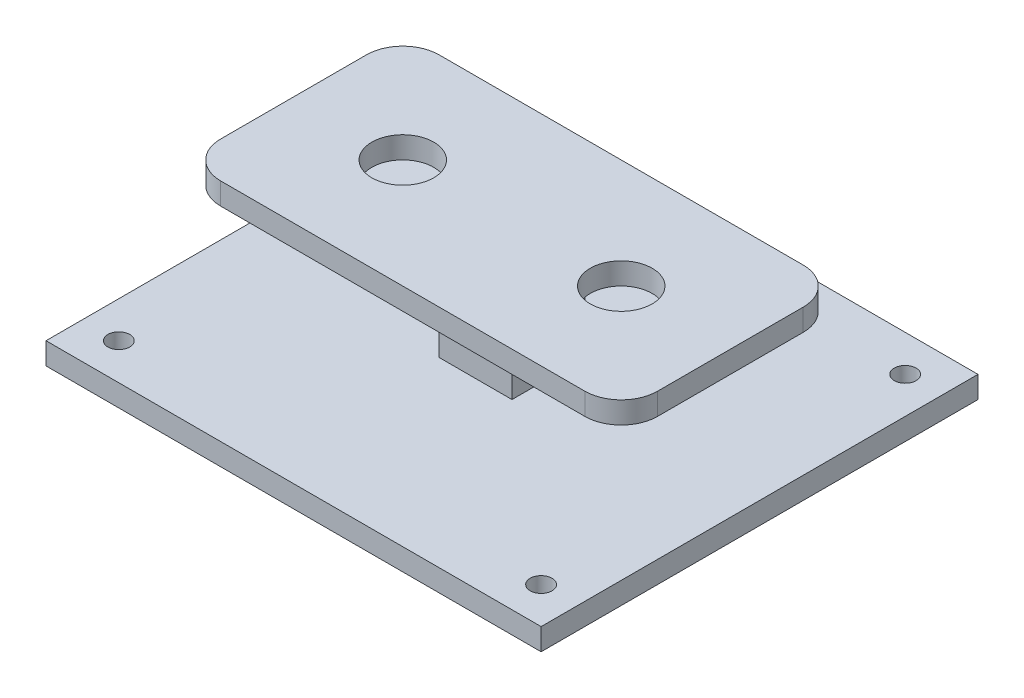
ISO-10303-21;
HEADER;
FILE_DESCRIPTION(('STEP AP214'),'2;1');
FILE_NAME('part.step','',(''),(''),'','','');
FILE_SCHEMA(('AUTOMOTIVE_DESIGN { 1 0 10303 214 1 1 1 1 }'));
ENDSEC;
DATA;
#1=APPLICATION_CONTEXT('core data for automotive mechanical design processes');
#2=APPLICATION_PROTOCOL_DEFINITION('international standard','automotive_design',2000,#1);
#3=PRODUCT_CONTEXT('',#1,'mechanical');
#4=PRODUCT('Part','Part','',(#3));
#5=PRODUCT_RELATED_PRODUCT_CATEGORY('part','',(#4));
#6=PRODUCT_DEFINITION_FORMATION('','',#4);
#7=PRODUCT_DEFINITION_CONTEXT('part definition',#1,'design');
#8=PRODUCT_DEFINITION('design','',#6,#7);
#9=PRODUCT_DEFINITION_SHAPE('','',#8);
#10=(LENGTH_UNIT() NAMED_UNIT(*) SI_UNIT(.MILLI.,.METRE.));
#11=(NAMED_UNIT(*) PLANE_ANGLE_UNIT() SI_UNIT($,.RADIAN.));
#12=(NAMED_UNIT(*) SI_UNIT($,.STERADIAN.) SOLID_ANGLE_UNIT());
#13=UNCERTAINTY_MEASURE_WITH_UNIT(LENGTH_MEASURE(1.E-05),#10,'distance_accuracy_value','');
#14=(GEOMETRIC_REPRESENTATION_CONTEXT(3) GLOBAL_UNCERTAINTY_ASSIGNED_CONTEXT((#13)) GLOBAL_UNIT_ASSIGNED_CONTEXT((#10,
#11,#12)) REPRESENTATION_CONTEXT('',''));
#15=CARTESIAN_POINT('',(0.,0.,0.));
#16=DIRECTION('',(0.,0.,1.));
#17=DIRECTION('',(1.,0.,0.));
#18=AXIS2_PLACEMENT_3D('',#15,#16,#17);
#19=CARTESIAN_POINT('',(0.,3.,0.));
#20=DIRECTION('',(0.,1.,0.));
#21=DIRECTION('',(0.,0.,1.));
#22=AXIS2_PLACEMENT_3D('',#19,#20,#21);
#23=PLANE('',#22);
#24=CARTESIAN_POINT('',(-29.,3.,25.));
#25=DIRECTION('',(0.,1.,0.));
#26=DIRECTION('',(0.,0.,1.));
#27=AXIS2_PLACEMENT_3D('',#24,#25,#26);
#28=CIRCLE('',#27,1.5);
#29=CARTESIAN_POINT('',(-29.,3.,26.5));
#30=VERTEX_POINT('',#29);
#31=EDGE_CURVE('E216',#30,#30,#28,.T.);
#32=ORIENTED_EDGE('',*,*,#31,.F.);
#33=EDGE_LOOP('',(#32));
#34=FACE_BOUND('',#33,.T.);
#35=CARTESIAN_POINT('',(-29.,3.,-25.));
#36=DIRECTION('',(0.,1.,0.));
#37=DIRECTION('',(0.,0.,1.));
#38=AXIS2_PLACEMENT_3D('',#35,#36,#37);
#39=CIRCLE('',#38,1.5);
#40=CARTESIAN_POINT('',(-29.,3.,-23.5));
#41=VERTEX_POINT('',#40);
#42=EDGE_CURVE('E232',#41,#41,#39,.T.);
#43=ORIENTED_EDGE('',*,*,#42,.F.);
#44=EDGE_LOOP('',(#43));
#45=FACE_BOUND('',#44,.T.);
#46=DIRECTION('',(0.,0.,-1.));
#47=VECTOR('',#46,1.);
#48=CARTESIAN_POINT('',(34.,3.,-30.));
#49=LINE('',#48,#47);
#50=CARTESIAN_POINT('',(34.,3.,30.));
#51=VERTEX_POINT('',#50);
#52=CARTESIAN_POINT('',(34.,3.,-30.));
#53=VERTEX_POINT('',#52);
#54=EDGE_CURVE('E240',#51,#53,#49,.T.);
#55=ORIENTED_EDGE('',*,*,#54,.T.);
#56=DIRECTION('',(-1.,0.,0.));
#57=VECTOR('',#56,1.);
#58=CARTESIAN_POINT('',(-34.,3.,-30.));
#59=LINE('',#58,#57);
#60=CARTESIAN_POINT('',(-34.,3.,-30.));
#61=VERTEX_POINT('',#60);
#62=EDGE_CURVE('E244',#53,#61,#59,.T.);
#63=ORIENTED_EDGE('',*,*,#62,.T.);
#64=DIRECTION('',(0.,0.,1.));
#65=VECTOR('',#64,1.);
#66=CARTESIAN_POINT('',(-34.,3.,-30.));
#67=LINE('',#66,#65);
#68=CARTESIAN_POINT('',(-34.,3.,30.));
#69=VERTEX_POINT('',#68);
#70=EDGE_CURVE('E248',#61,#69,#67,.T.);
#71=ORIENTED_EDGE('',*,*,#70,.T.);
#72=DIRECTION('',(1.,0.,0.));
#73=VECTOR('',#72,1.);
#74=CARTESIAN_POINT('',(-34.,3.,30.));
#75=LINE('',#74,#73);
#76=EDGE_CURVE('E251',#69,#51,#75,.T.);
#77=ORIENTED_EDGE('',*,*,#76,.T.);
#78=EDGE_LOOP('',(#55,#63,#71,#77));
#79=FACE_BOUND('',#78,.T.);
#80=CARTESIAN_POINT('',(29.,3.,-25.0000000000001));
#81=DIRECTION('',(0.,1.,0.));
#82=DIRECTION('',(0.,0.,1.));
#83=AXIS2_PLACEMENT_3D('',#80,#81,#82);
#84=CIRCLE('',#83,1.5);
#85=CARTESIAN_POINT('',(29.,3.,-23.5000000000001));
#86=VERTEX_POINT('',#85);
#87=EDGE_CURVE('E224',#86,#86,#84,.T.);
#88=ORIENTED_EDGE('',*,*,#87,.F.);
#89=EDGE_LOOP('',(#88));
#90=FACE_BOUND('',#89,.T.);
#91=CARTESIAN_POINT('',(29.,3.,24.9999999999999));
#92=DIRECTION('',(0.,1.,0.));
#93=DIRECTION('',(0.,0.,1.));
#94=AXIS2_PLACEMENT_3D('',#91,#92,#93);
#95=CIRCLE('',#94,1.5);
#96=CARTESIAN_POINT('',(29.,3.,26.4999999999999));
#97=VERTEX_POINT('',#96);
#98=EDGE_CURVE('E208',#97,#97,#95,.T.);
#99=ORIENTED_EDGE('',*,*,#98,.F.);
#100=EDGE_LOOP('',(#99));
#101=FACE_BOUND('',#100,.T.);
#102=DIRECTION('',(-1.,0.,0.));
#103=VECTOR('',#102,1.);
#104=CARTESIAN_POINT('',(-5.,3.,-5.));
#105=LINE('',#104,#103);
#106=CARTESIAN_POINT('',(5.,3.,-5.));
#107=VERTEX_POINT('',#106);
#108=CARTESIAN_POINT('',(-5.,3.,-5.));
#109=VERTEX_POINT('',#108);
#110=EDGE_CURVE('E189',#107,#109,#105,.T.);
#111=ORIENTED_EDGE('',*,*,#110,.F.);
#112=DIRECTION('',(0.,0.,-1.));
#113=VECTOR('',#112,1.);
#114=CARTESIAN_POINT('',(5.,3.,-5.));
#115=LINE('',#114,#113);
#116=CARTESIAN_POINT('',(5.,3.,5.));
#117=VERTEX_POINT('',#116);
#118=EDGE_CURVE('E186',#117,#107,#115,.T.);
#119=ORIENTED_EDGE('',*,*,#118,.F.);
#120=DIRECTION('',(1.,0.,0.));
#121=VECTOR('',#120,1.);
#122=CARTESIAN_POINT('',(-5.,3.,5.));
#123=LINE('',#122,#121);
#124=CARTESIAN_POINT('',(-5.,3.,5.));
#125=VERTEX_POINT('',#124);
#126=EDGE_CURVE('E166',#125,#117,#123,.T.);
#127=ORIENTED_EDGE('',*,*,#126,.F.);
#128=DIRECTION('',(0.,0.,1.));
#129=VECTOR('',#128,1.);
#130=CARTESIAN_POINT('',(-5.,3.,-5.));
#131=LINE('',#130,#129);
#132=EDGE_CURVE('E193',#109,#125,#131,.T.);
#133=ORIENTED_EDGE('',*,*,#132,.F.);
#134=EDGE_LOOP('',(#111,#119,#127,#133));
#135=FACE_BOUND('',#134,.T.);
#136=ADVANCED_FACE('F39',(#34,#45,#79,#90,#101,#135),#23,.T.);
#137=CARTESIAN_POINT('',(0.,0.,0.));
#138=DIRECTION('',(0.,1.,0.));
#139=DIRECTION('',(0.,0.,1.));
#140=AXIS2_PLACEMENT_3D('',#137,#138,#139);
#141=PLANE('',#140);
#142=DIRECTION('',(0.,0.,-1.));
#143=VECTOR('',#142,1.);
#144=CARTESIAN_POINT('',(34.,0.,-30.));
#145=LINE('',#144,#143);
#146=CARTESIAN_POINT('',(34.,0.,30.));
#147=VERTEX_POINT('',#146);
#148=CARTESIAN_POINT('',(34.,0.,-30.));
#149=VERTEX_POINT('',#148);
#150=EDGE_CURVE('E236',#147,#149,#145,.T.);
#151=ORIENTED_EDGE('',*,*,#150,.F.);
#152=DIRECTION('',(1.,0.,0.));
#153=VECTOR('',#152,1.);
#154=CARTESIAN_POINT('',(-34.,0.,30.));
#155=LINE('',#154,#153);
#156=CARTESIAN_POINT('',(-34.,0.,30.));
#157=VERTEX_POINT('',#156);
#158=EDGE_CURVE('E245',#157,#147,#155,.T.);
#159=ORIENTED_EDGE('',*,*,#158,.F.);
#160=DIRECTION('',(0.,0.,1.));
#161=VECTOR('',#160,1.);
#162=CARTESIAN_POINT('',(-34.,0.,-30.));
#163=LINE('',#162,#161);
#164=CARTESIAN_POINT('',(-34.,0.,-30.));
#165=VERTEX_POINT('',#164);
#166=EDGE_CURVE('E261',#165,#157,#163,.T.);
#167=ORIENTED_EDGE('',*,*,#166,.F.);
#168=DIRECTION('',(-1.,0.,0.));
#169=VECTOR('',#168,1.);
#170=CARTESIAN_POINT('',(-34.,0.,-30.));
#171=LINE('',#170,#169);
#172=EDGE_CURVE('E258',#149,#165,#171,.T.);
#173=ORIENTED_EDGE('',*,*,#172,.F.);
#174=EDGE_LOOP('',(#151,#159,#167,#173));
#175=FACE_BOUND('',#174,.T.);
#176=CARTESIAN_POINT('',(-29.,0.,-25.));
#177=DIRECTION('',(0.,1.,0.));
#178=DIRECTION('',(0.,0.,1.));
#179=AXIS2_PLACEMENT_3D('',#176,#177,#178);
#180=CIRCLE('',#179,1.5);
#181=CARTESIAN_POINT('',(-29.,0.,-23.5));
#182=VERTEX_POINT('',#181);
#183=EDGE_CURVE('E228',#182,#182,#180,.T.);
#184=ORIENTED_EDGE('',*,*,#183,.T.);
#185=EDGE_LOOP('',(#184));
#186=FACE_BOUND('',#185,.T.);
#187=CARTESIAN_POINT('',(29.,0.,-25.0000000000001));
#188=DIRECTION('',(0.,1.,0.));
#189=DIRECTION('',(0.,0.,1.));
#190=AXIS2_PLACEMENT_3D('',#187,#188,#189);
#191=CIRCLE('',#190,1.5);
#192=CARTESIAN_POINT('',(29.,0.,-23.5000000000001));
#193=VERTEX_POINT('',#192);
#194=EDGE_CURVE('E220',#193,#193,#191,.T.);
#195=ORIENTED_EDGE('',*,*,#194,.T.);
#196=EDGE_LOOP('',(#195));
#197=FACE_BOUND('',#196,.T.);
#198=CARTESIAN_POINT('',(-29.,0.,25.));
#199=DIRECTION('',(0.,1.,0.));
#200=DIRECTION('',(0.,0.,1.));
#201=AXIS2_PLACEMENT_3D('',#198,#199,#200);
#202=CIRCLE('',#201,1.5);
#203=CARTESIAN_POINT('',(-29.,0.,26.5));
#204=VERTEX_POINT('',#203);
#205=EDGE_CURVE('E212',#204,#204,#202,.T.);
#206=ORIENTED_EDGE('',*,*,#205,.T.);
#207=EDGE_LOOP('',(#206));
#208=FACE_BOUND('',#207,.T.);
#209=CARTESIAN_POINT('',(29.,0.,24.9999999999999));
#210=DIRECTION('',(0.,1.,0.));
#211=DIRECTION('',(0.,0.,1.));
#212=AXIS2_PLACEMENT_3D('',#209,#210,#211);
#213=CIRCLE('',#212,1.5);
#214=CARTESIAN_POINT('',(29.,0.,26.4999999999999));
#215=VERTEX_POINT('',#214);
#216=EDGE_CURVE('E207',#215,#215,#213,.T.);
#217=ORIENTED_EDGE('',*,*,#216,.T.);
#218=EDGE_LOOP('',(#217));
#219=FACE_BOUND('',#218,.T.);
#220=ADVANCED_FACE('F356',(#175,#186,#197,#208,#219),#141,.F.);
#221=CARTESIAN_POINT('',(34.,3.,-30.));
#222=DIRECTION('',(-1.,0.,0.));
#223=DIRECTION('',(0.,0.,1.));
#224=AXIS2_PLACEMENT_3D('',#221,#222,#223);
#225=PLANE('',#224);
#226=ORIENTED_EDGE('',*,*,#150,.T.);
#227=DIRECTION('',(0.,-1.,0.));
#228=VECTOR('',#227,1.);
#229=CARTESIAN_POINT('',(34.,3.,-30.));
#230=LINE('',#229,#228);
#231=EDGE_CURVE('E277',#53,#149,#230,.T.);
#232=ORIENTED_EDGE('',*,*,#231,.F.);
#233=ORIENTED_EDGE('',*,*,#54,.F.);
#234=DIRECTION('',(0.,-1.,0.));
#235=VECTOR('',#234,1.);
#236=CARTESIAN_POINT('',(34.,3.,30.));
#237=LINE('',#236,#235);
#238=EDGE_CURVE('E254',#51,#147,#237,.T.);
#239=ORIENTED_EDGE('',*,*,#238,.T.);
#240=EDGE_LOOP('',(#226,#232,#233,#239));
#241=FACE_BOUND('',#240,.T.);
#242=ADVANCED_FACE('F362',(#241),#225,.F.);
#243=CARTESIAN_POINT('',(-34.,3.,-30.));
#244=DIRECTION('',(0.,0.,1.));
#245=DIRECTION('',(1.,0.,0.));
#246=AXIS2_PLACEMENT_3D('',#243,#244,#245);
#247=PLANE('',#246);
#248=ORIENTED_EDGE('',*,*,#172,.T.);
#249=DIRECTION('',(0.,-1.,0.));
#250=VECTOR('',#249,1.);
#251=CARTESIAN_POINT('',(-34.,3.,-30.));
#252=LINE('',#251,#250);
#253=EDGE_CURVE('E273',#61,#165,#252,.T.);
#254=ORIENTED_EDGE('',*,*,#253,.F.);
#255=ORIENTED_EDGE('',*,*,#62,.F.);
#256=ORIENTED_EDGE('',*,*,#231,.T.);
#257=EDGE_LOOP('',(#248,#254,#255,#256));
#258=FACE_BOUND('',#257,.T.);
#259=ADVANCED_FACE('F378',(#258),#247,.F.);
#260=CARTESIAN_POINT('',(-34.,3.,-30.));
#261=DIRECTION('',(1.,0.,0.));
#262=DIRECTION('',(0.,0.,-1.));
#263=AXIS2_PLACEMENT_3D('',#260,#261,#262);
#264=PLANE('',#263);
#265=ORIENTED_EDGE('',*,*,#166,.T.);
#266=DIRECTION('',(0.,-1.,0.));
#267=VECTOR('',#266,1.);
#268=CARTESIAN_POINT('',(-34.,3.,30.));
#269=LINE('',#268,#267);
#270=EDGE_CURVE('E269',#69,#157,#269,.T.);
#271=ORIENTED_EDGE('',*,*,#270,.F.);
#272=ORIENTED_EDGE('',*,*,#70,.F.);
#273=ORIENTED_EDGE('',*,*,#253,.T.);
#274=EDGE_LOOP('',(#265,#271,#272,#273));
#275=FACE_BOUND('',#274,.T.);
#276=ADVANCED_FACE('F374',(#275),#264,.F.);
#277=CARTESIAN_POINT('',(-34.,3.,30.));
#278=DIRECTION('',(0.,0.,-1.));
#279=DIRECTION('',(-1.,0.,0.));
#280=AXIS2_PLACEMENT_3D('',#277,#278,#279);
#281=PLANE('',#280);
#282=ORIENTED_EDGE('',*,*,#158,.T.);
#283=ORIENTED_EDGE('',*,*,#238,.F.);
#284=ORIENTED_EDGE('',*,*,#76,.F.);
#285=ORIENTED_EDGE('',*,*,#270,.T.);
#286=EDGE_LOOP('',(#282,#283,#284,#285));
#287=FACE_BOUND('',#286,.T.);
#288=ADVANCED_FACE('F371',(#287),#281,.F.);
#289=CARTESIAN_POINT('',(-29.,3.,-25.));
#290=DIRECTION('',(0.,-1.,0.));
#291=DIRECTION('',(0.,0.,-1.));
#292=AXIS2_PLACEMENT_3D('',#289,#290,#291);
#293=CYLINDRICAL_SURFACE('',#292,1.5);
#294=ORIENTED_EDGE('',*,*,#42,.T.);
#295=EDGE_LOOP('',(#294));
#296=FACE_BOUND('',#295,.T.);
#297=ORIENTED_EDGE('',*,*,#183,.F.);
#298=EDGE_LOOP('',(#297));
#299=FACE_BOUND('',#298,.T.);
#300=ADVANCED_FACE('F368',(#296,#299),#293,.F.);
#301=CARTESIAN_POINT('',(29.,3.,-25.0000000000001));
#302=DIRECTION('',(0.,-1.,0.));
#303=DIRECTION('',(0.,0.,-1.));
#304=AXIS2_PLACEMENT_3D('',#301,#302,#303);
#305=CYLINDRICAL_SURFACE('',#304,1.5);
#306=ORIENTED_EDGE('',*,*,#87,.T.);
#307=EDGE_LOOP('',(#306));
#308=FACE_BOUND('',#307,.T.);
#309=ORIENTED_EDGE('',*,*,#194,.F.);
#310=EDGE_LOOP('',(#309));
#311=FACE_BOUND('',#310,.T.);
#312=ADVANCED_FACE('F460',(#308,#311),#305,.F.);
#313=CARTESIAN_POINT('',(-29.,3.,25.));
#314=DIRECTION('',(0.,-1.,0.));
#315=DIRECTION('',(0.,0.,-1.));
#316=AXIS2_PLACEMENT_3D('',#313,#314,#315);
#317=CYLINDRICAL_SURFACE('',#316,1.5);
#318=ORIENTED_EDGE('',*,*,#31,.T.);
#319=EDGE_LOOP('',(#318));
#320=FACE_BOUND('',#319,.T.);
#321=ORIENTED_EDGE('',*,*,#205,.F.);
#322=EDGE_LOOP('',(#321));
#323=FACE_BOUND('',#322,.T.);
#324=ADVANCED_FACE('F457',(#320,#323),#317,.F.);
#325=CARTESIAN_POINT('',(29.,3.,24.9999999999999));
#326=DIRECTION('',(0.,-1.,0.));
#327=DIRECTION('',(0.,0.,-1.));
#328=AXIS2_PLACEMENT_3D('',#325,#326,#327);
#329=CYLINDRICAL_SURFACE('',#328,1.5);
#330=ORIENTED_EDGE('',*,*,#98,.T.);
#331=EDGE_LOOP('',(#330));
#332=FACE_BOUND('',#331,.T.);
#333=ORIENTED_EDGE('',*,*,#216,.F.);
#334=EDGE_LOOP('',(#333));
#335=FACE_BOUND('',#334,.T.);
#336=ADVANCED_FACE('F454',(#332,#335),#329,.F.);
#337=CARTESIAN_POINT('',(5.,16.,-5.));
#338=DIRECTION('',(-1.,0.,0.));
#339=DIRECTION('',(0.,0.,1.));
#340=AXIS2_PLACEMENT_3D('',#337,#338,#339);
#341=PLANE('',#340);
#342=ORIENTED_EDGE('',*,*,#118,.T.);
#343=DIRECTION('',(0.,-1.,0.));
#344=VECTOR('',#343,1.);
#345=CARTESIAN_POINT('',(5.,16.,-5.));
#346=LINE('',#345,#344);
#347=CARTESIAN_POINT('',(5.,16.,-5.));
#348=VERTEX_POINT('',#347);
#349=EDGE_CURVE('E160',#348,#107,#346,.T.);
#350=ORIENTED_EDGE('',*,*,#349,.F.);
#351=DIRECTION('',(0.,0.,-1.));
#352=VECTOR('',#351,1.);
#353=CARTESIAN_POINT('',(5.,16.,-5.));
#354=LINE('',#353,#352);
#355=CARTESIAN_POINT('',(5.,16.,5.));
#356=VERTEX_POINT('',#355);
#357=EDGE_CURVE('E154',#356,#348,#354,.T.);
#358=ORIENTED_EDGE('',*,*,#357,.F.);
#359=DIRECTION('',(0.,-1.,0.));
#360=VECTOR('',#359,1.);
#361=CARTESIAN_POINT('',(5.,16.,5.));
#362=LINE('',#361,#360);
#363=EDGE_CURVE('E158',#356,#117,#362,.T.);
#364=ORIENTED_EDGE('',*,*,#363,.T.);
#365=EDGE_LOOP('',(#342,#350,#358,#364));
#366=FACE_BOUND('',#365,.T.);
#367=ADVANCED_FACE('F157',(#366),#341,.F.);
#368=CARTESIAN_POINT('',(-5.,16.,-5.));
#369=DIRECTION('',(0.,0.,1.));
#370=DIRECTION('',(1.,0.,0.));
#371=AXIS2_PLACEMENT_3D('',#368,#369,#370);
#372=PLANE('',#371);
#373=ORIENTED_EDGE('',*,*,#110,.T.);
#374=DIRECTION('',(0.,-1.,0.));
#375=VECTOR('',#374,1.);
#376=CARTESIAN_POINT('',(-5.,16.,-5.));
#377=LINE('',#376,#375);
#378=CARTESIAN_POINT('',(-5.,16.,-5.));
#379=VERTEX_POINT('',#378);
#380=EDGE_CURVE('E201',#379,#109,#377,.T.);
#381=ORIENTED_EDGE('',*,*,#380,.F.);
#382=DIRECTION('',(-1.,0.,0.));
#383=VECTOR('',#382,1.);
#384=CARTESIAN_POINT('',(-5.,16.,-5.));
#385=LINE('',#384,#383);
#386=EDGE_CURVE('E165',#348,#379,#385,.T.);
#387=ORIENTED_EDGE('',*,*,#386,.F.);
#388=ORIENTED_EDGE('',*,*,#349,.T.);
#389=EDGE_LOOP('',(#373,#381,#387,#388));
#390=FACE_BOUND('',#389,.T.);
#391=ADVANCED_FACE('F349',(#390),#372,.F.);
#392=CARTESIAN_POINT('',(-5.,16.,-5.));
#393=DIRECTION('',(1.,0.,0.));
#394=DIRECTION('',(0.,0.,-1.));
#395=AXIS2_PLACEMENT_3D('',#392,#393,#394);
#396=PLANE('',#395);
#397=ORIENTED_EDGE('',*,*,#132,.T.);
#398=DIRECTION('',(0.,-1.,0.));
#399=VECTOR('',#398,1.);
#400=CARTESIAN_POINT('',(-5.,16.,5.));
#401=LINE('',#400,#399);
#402=CARTESIAN_POINT('',(-5.,16.,5.));
#403=VERTEX_POINT('',#402);
#404=EDGE_CURVE('E175',#403,#125,#401,.T.);
#405=ORIENTED_EDGE('',*,*,#404,.F.);
#406=DIRECTION('',(0.,0.,1.));
#407=VECTOR('',#406,1.);
#408=CARTESIAN_POINT('',(-5.,16.,-5.));
#409=LINE('',#408,#407);
#410=EDGE_CURVE('E179',#379,#403,#409,.T.);
#411=ORIENTED_EDGE('',*,*,#410,.F.);
#412=ORIENTED_EDGE('',*,*,#380,.T.);
#413=EDGE_LOOP('',(#397,#405,#411,#412));
#414=FACE_BOUND('',#413,.T.);
#415=ADVANCED_FACE('F353',(#414),#396,.F.);
#416=CARTESIAN_POINT('',(-5.,16.,5.));
#417=DIRECTION('',(0.,0.,-1.));
#418=DIRECTION('',(-1.,0.,0.));
#419=AXIS2_PLACEMENT_3D('',#416,#417,#418);
#420=PLANE('',#419);
#421=ORIENTED_EDGE('',*,*,#126,.T.);
#422=ORIENTED_EDGE('',*,*,#363,.F.);
#423=DIRECTION('',(1.,0.,0.));
#424=VECTOR('',#423,1.);
#425=CARTESIAN_POINT('',(-5.,16.,5.));
#426=LINE('',#425,#424);
#427=EDGE_CURVE('E171',#403,#356,#426,.T.);
#428=ORIENTED_EDGE('',*,*,#427,.F.);
#429=ORIENTED_EDGE('',*,*,#404,.T.);
#430=EDGE_LOOP('',(#421,#422,#428,#429));
#431=FACE_BOUND('',#430,.T.);
#432=ADVANCED_FACE('F170',(#431),#420,.F.);
#433=CARTESIAN_POINT('',(0.,16.,0.));
#434=DIRECTION('',(0.,1.,0.));
#435=DIRECTION('',(0.,0.,1.));
#436=AXIS2_PLACEMENT_3D('',#433,#434,#435);
#437=PLANE('',#436);
#438=CARTESIAN_POINT('',(-15.,16.,0.));
#439=DIRECTION('',(0.,1.,0.));
#440=DIRECTION('',(0.,0.,1.));
#441=AXIS2_PLACEMENT_3D('',#438,#439,#440);
#442=CIRCLE('',#441,4.25);
#443=CARTESIAN_POINT('',(-15.,16.,4.25));
#444=VERTEX_POINT('',#443);
#445=EDGE_CURVE('E425',#444,#444,#442,.T.);
#446=ORIENTED_EDGE('',*,*,#445,.T.);
#447=EDGE_LOOP('',(#446));
#448=FACE_BOUND('',#447,.T.);
#449=CARTESIAN_POINT('',(15.,16.,0.));
#450=DIRECTION('',(0.,1.,0.));
#451=DIRECTION('',(0.,0.,1.));
#452=AXIS2_PLACEMENT_3D('',#449,#450,#451);
#453=CIRCLE('',#452,4.25);
#454=CARTESIAN_POINT('',(15.,16.,4.25));
#455=VERTEX_POINT('',#454);
#456=EDGE_CURVE('E663',#455,#455,#453,.T.);
#457=ORIENTED_EDGE('',*,*,#456,.T.);
#458=EDGE_LOOP('',(#457));
#459=FACE_BOUND('',#458,.T.);
#460=DIRECTION('',(0.,0.,1.));
#461=VECTOR('',#460,1.);
#462=CARTESIAN_POINT('',(-30.,16.,-15.));
#463=LINE('',#462,#461);
#464=CARTESIAN_POINT('',(-30.,16.,-10.));
#465=VERTEX_POINT('',#464);
#466=CARTESIAN_POINT('',(-30.,16.,10.));
#467=VERTEX_POINT('',#466);
#468=EDGE_CURVE('E337',#465,#467,#463,.T.);
#469=ORIENTED_EDGE('',*,*,#468,.F.);
#470=CARTESIAN_POINT('',(-25.,16.,-10.));
#471=DIRECTION('',(0.,1.,0.));
#472=DIRECTION('',(0.,0.,1.));
#473=AXIS2_PLACEMENT_3D('',#470,#471,#472);
#474=CIRCLE('',#473,5.);
#475=CARTESIAN_POINT('',(-25.,16.,-15.));
#476=VERTEX_POINT('',#475);
#477=EDGE_CURVE('E297',#465,#476,#474,.F.);
#478=ORIENTED_EDGE('',*,*,#477,.T.);
#479=DIRECTION('',(-1.,0.,0.));
#480=VECTOR('',#479,1.);
#481=CARTESIAN_POINT('',(-30.,16.,-15.));
#482=LINE('',#481,#480);
#483=CARTESIAN_POINT('',(25.,16.,-15.));
#484=VERTEX_POINT('',#483);
#485=EDGE_CURVE('E344',#484,#476,#482,.T.);
#486=ORIENTED_EDGE('',*,*,#485,.F.);
#487=CARTESIAN_POINT('',(25.,16.,-10.));
#488=DIRECTION('',(0.,1.,0.));
#489=DIRECTION('',(0.,0.,1.));
#490=AXIS2_PLACEMENT_3D('',#487,#488,#489);
#491=CIRCLE('',#490,5.);
#492=CARTESIAN_POINT('',(30.,16.,-10.));
#493=VERTEX_POINT('',#492);
#494=EDGE_CURVE('E291',#484,#493,#491,.F.);
#495=ORIENTED_EDGE('',*,*,#494,.T.);
#496=DIRECTION('',(0.,0.,-1.));
#497=VECTOR('',#496,1.);
#498=CARTESIAN_POINT('',(30.,16.,-15.));
#499=LINE('',#498,#497);
#500=CARTESIAN_POINT('',(30.,16.,9.99999999999999));
#501=VERTEX_POINT('',#500);
#502=EDGE_CURVE('E422',#501,#493,#499,.T.);
#503=ORIENTED_EDGE('',*,*,#502,.F.);
#504=CARTESIAN_POINT('',(25.,16.,10.));
#505=DIRECTION('',(0.,1.,0.));
#506=DIRECTION('',(0.,0.,1.));
#507=AXIS2_PLACEMENT_3D('',#504,#505,#506);
#508=CIRCLE('',#507,5.);
#509=CARTESIAN_POINT('',(25.,16.,15.));
#510=VERTEX_POINT('',#509);
#511=EDGE_CURVE('E294',#501,#510,#508,.F.);
#512=ORIENTED_EDGE('',*,*,#511,.T.);
#513=DIRECTION('',(1.,0.,0.));
#514=VECTOR('',#513,1.);
#515=CARTESIAN_POINT('',(-30.,16.,15.));
#516=LINE('',#515,#514);
#517=CARTESIAN_POINT('',(-25.,16.,15.));
#518=VERTEX_POINT('',#517);
#519=EDGE_CURVE('E329',#518,#510,#516,.T.);
#520=ORIENTED_EDGE('',*,*,#519,.F.);
#521=CARTESIAN_POINT('',(-25.,16.,10.));
#522=DIRECTION('',(0.,1.,0.));
#523=DIRECTION('',(0.,0.,1.));
#524=AXIS2_PLACEMENT_3D('',#521,#522,#523);
#525=CIRCLE('',#524,5.);
#526=EDGE_CURVE('E288',#518,#467,#525,.F.);
#527=ORIENTED_EDGE('',*,*,#526,.T.);
#528=EDGE_LOOP('',(#469,#478,#486,#495,#503,#512,#520,#527));
#529=FACE_BOUND('',#528,.T.);
#530=ORIENTED_EDGE('',*,*,#427,.T.);
#531=ORIENTED_EDGE('',*,*,#357,.T.);
#532=ORIENTED_EDGE('',*,*,#386,.T.);
#533=ORIENTED_EDGE('',*,*,#410,.T.);
#534=EDGE_LOOP('',(#530,#531,#532,#533));
#535=FACE_BOUND('',#534,.T.);
#536=ADVANCED_FACE('F177',(#448,#459,#529,#535),#437,.F.);
#537=CARTESIAN_POINT('',(30.,19.,-15.));
#538=DIRECTION('',(-1.,0.,0.));
#539=DIRECTION('',(0.,0.,1.));
#540=AXIS2_PLACEMENT_3D('',#537,#538,#539);
#541=PLANE('',#540);
#542=DIRECTION('',(0.,0.,-1.));
#543=VECTOR('',#542,1.);
#544=CARTESIAN_POINT('',(30.,19.,-15.));
#545=LINE('',#544,#543);
#546=CARTESIAN_POINT('',(30.,19.,9.99999999999999));
#547=VERTEX_POINT('',#546);
#548=CARTESIAN_POINT('',(30.,19.,-10.));
#549=VERTEX_POINT('',#548);
#550=EDGE_CURVE('E336',#547,#549,#545,.T.);
#551=ORIENTED_EDGE('',*,*,#550,.F.);
#552=DIRECTION('',(0.,-1.,0.));
#553=VECTOR('',#552,1.);
#554=CARTESIAN_POINT('',(30.,19.,10.));
#555=LINE('',#554,#553);
#556=EDGE_CURVE('E321',#547,#501,#555,.T.);
#557=ORIENTED_EDGE('',*,*,#556,.T.);
#558=ORIENTED_EDGE('',*,*,#502,.T.);
#559=DIRECTION('',(0.,-1.,0.));
#560=VECTOR('',#559,1.);
#561=CARTESIAN_POINT('',(30.,19.,-10.));
#562=LINE('',#561,#560);
#563=EDGE_CURVE('E318',#493,#549,#562,.F.);
#564=ORIENTED_EDGE('',*,*,#563,.T.);
#565=EDGE_LOOP('',(#551,#557,#558,#564));
#566=FACE_BOUND('',#565,.T.);
#567=ADVANCED_FACE('F439',(#566),#541,.F.);
#568=CARTESIAN_POINT('',(-30.,19.,-15.));
#569=DIRECTION('',(0.,0.,1.));
#570=DIRECTION('',(1.,0.,0.));
#571=AXIS2_PLACEMENT_3D('',#568,#569,#570);
#572=PLANE('',#571);
#573=ORIENTED_EDGE('',*,*,#485,.T.);
#574=DIRECTION('',(0.,-1.,0.));
#575=VECTOR('',#574,1.);
#576=CARTESIAN_POINT('',(-25.,19.,-15.));
#577=LINE('',#576,#575);
#578=CARTESIAN_POINT('',(-25.,19.,-15.));
#579=VERTEX_POINT('',#578);
#580=EDGE_CURVE('E304',#476,#579,#577,.F.);
#581=ORIENTED_EDGE('',*,*,#580,.T.);
#582=DIRECTION('',(-1.,0.,0.));
#583=VECTOR('',#582,1.);
#584=CARTESIAN_POINT('',(-30.,19.,-15.));
#585=LINE('',#584,#583);
#586=CARTESIAN_POINT('',(25.,19.,-15.));
#587=VERTEX_POINT('',#586);
#588=EDGE_CURVE('E342',#587,#579,#585,.T.);
#589=ORIENTED_EDGE('',*,*,#588,.F.);
#590=DIRECTION('',(0.,-1.,0.));
#591=VECTOR('',#590,1.);
#592=CARTESIAN_POINT('',(25.,19.,-15.));
#593=LINE('',#592,#591);
#594=EDGE_CURVE('E300',#587,#484,#593,.T.);
#595=ORIENTED_EDGE('',*,*,#594,.T.);
#596=EDGE_LOOP('',(#573,#581,#589,#595));
#597=FACE_BOUND('',#596,.T.);
#598=ADVANCED_FACE('F410',(#597),#572,.F.);
#599=CARTESIAN_POINT('',(-30.,19.,-15.));
#600=DIRECTION('',(1.,0.,0.));
#601=DIRECTION('',(0.,0.,-1.));
#602=AXIS2_PLACEMENT_3D('',#599,#600,#601);
#603=PLANE('',#602);
#604=DIRECTION('',(0.,0.,1.));
#605=VECTOR('',#604,1.);
#606=CARTESIAN_POINT('',(-30.,19.,-15.));
#607=LINE('',#606,#605);
#608=CARTESIAN_POINT('',(-30.,19.,-10.));
#609=VERTEX_POINT('',#608);
#610=CARTESIAN_POINT('',(-30.,19.,10.));
#611=VERTEX_POINT('',#610);
#612=EDGE_CURVE('E414',#609,#611,#607,.T.);
#613=ORIENTED_EDGE('',*,*,#612,.F.);
#614=DIRECTION('',(0.,-1.,0.));
#615=VECTOR('',#614,1.);
#616=CARTESIAN_POINT('',(-30.,19.,-10.));
#617=LINE('',#616,#615);
#618=EDGE_CURVE('E284',#609,#465,#617,.T.);
#619=ORIENTED_EDGE('',*,*,#618,.T.);
#620=ORIENTED_EDGE('',*,*,#468,.T.);
#621=DIRECTION('',(0.,-1.,0.));
#622=VECTOR('',#621,1.);
#623=CARTESIAN_POINT('',(-30.,19.,10.));
#624=LINE('',#623,#622);
#625=EDGE_CURVE('E281',#467,#611,#624,.F.);
#626=ORIENTED_EDGE('',*,*,#625,.T.);
#627=EDGE_LOOP('',(#613,#619,#620,#626));
#628=FACE_BOUND('',#627,.T.);
#629=ADVANCED_FACE('F430',(#628),#603,.F.);
#630=CARTESIAN_POINT('',(-30.,19.,15.));
#631=DIRECTION('',(0.,0.,-1.));
#632=DIRECTION('',(-1.,0.,0.));
#633=AXIS2_PLACEMENT_3D('',#630,#631,#632);
#634=PLANE('',#633);
#635=ORIENTED_EDGE('',*,*,#519,.T.);
#636=DIRECTION('',(0.,-1.,0.));
#637=VECTOR('',#636,1.);
#638=CARTESIAN_POINT('',(25.,19.,15.));
#639=LINE('',#638,#637);
#640=CARTESIAN_POINT('',(25.,19.,15.));
#641=VERTEX_POINT('',#640);
#642=EDGE_CURVE('E11',#510,#641,#639,.F.);
#643=ORIENTED_EDGE('',*,*,#642,.T.);
#644=DIRECTION('',(1.,0.,0.));
#645=VECTOR('',#644,1.);
#646=CARTESIAN_POINT('',(-30.,19.,15.));
#647=LINE('',#646,#645);
#648=CARTESIAN_POINT('',(-25.,19.,15.));
#649=VERTEX_POINT('',#648);
#650=EDGE_CURVE('E190',#649,#641,#647,.T.);
#651=ORIENTED_EDGE('',*,*,#650,.F.);
#652=DIRECTION('',(0.,-1.,0.));
#653=VECTOR('',#652,1.);
#654=CARTESIAN_POINT('',(-25.,19.,15.));
#655=LINE('',#654,#653);
#656=EDGE_CURVE('E48',#649,#518,#655,.T.);
#657=ORIENTED_EDGE('',*,*,#656,.T.);
#658=EDGE_LOOP('',(#635,#643,#651,#657));
#659=FACE_BOUND('',#658,.T.);
#660=ADVANCED_FACE('F328',(#659),#634,.F.);
#661=CARTESIAN_POINT('',(0.,19.,0.));
#662=DIRECTION('',(0.,1.,0.));
#663=DIRECTION('',(0.,0.,1.));
#664=AXIS2_PLACEMENT_3D('',#661,#662,#663);
#665=PLANE('',#664);
#666=CARTESIAN_POINT('',(-15.,19.,0.));
#667=DIRECTION('',(0.,1.,0.));
#668=DIRECTION('',(0.,0.,1.));
#669=AXIS2_PLACEMENT_3D('',#666,#667,#668);
#670=CIRCLE('',#669,4.25);
#671=CARTESIAN_POINT('',(-15.,19.,4.25));
#672=VERTEX_POINT('',#671);
#673=EDGE_CURVE('E661',#672,#672,#670,.T.);
#674=ORIENTED_EDGE('',*,*,#673,.F.);
#675=EDGE_LOOP('',(#674));
#676=FACE_BOUND('',#675,.T.);
#677=CARTESIAN_POINT('',(15.,19.,0.));
#678=DIRECTION('',(0.,1.,0.));
#679=DIRECTION('',(0.,0.,1.));
#680=AXIS2_PLACEMENT_3D('',#677,#678,#679);
#681=CIRCLE('',#680,4.25);
#682=CARTESIAN_POINT('',(15.,19.,4.25));
#683=VERTEX_POINT('',#682);
#684=EDGE_CURVE('E669',#683,#683,#681,.T.);
#685=ORIENTED_EDGE('',*,*,#684,.F.);
#686=EDGE_LOOP('',(#685));
#687=FACE_BOUND('',#686,.T.);
#688=ORIENTED_EDGE('',*,*,#588,.T.);
#689=CARTESIAN_POINT('',(-25.,19.,-10.));
#690=DIRECTION('',(0.,1.,0.));
#691=DIRECTION('',(0.,0.,1.));
#692=AXIS2_PLACEMENT_3D('',#689,#690,#691);
#693=CIRCLE('',#692,5.);
#694=EDGE_CURVE('E315',#579,#609,#693,.T.);
#695=ORIENTED_EDGE('',*,*,#694,.T.);
#696=ORIENTED_EDGE('',*,*,#612,.T.);
#697=CARTESIAN_POINT('',(-25.,19.,10.));
#698=DIRECTION('',(0.,1.,0.));
#699=DIRECTION('',(0.,0.,1.));
#700=AXIS2_PLACEMENT_3D('',#697,#698,#699);
#701=CIRCLE('',#700,5.);
#702=EDGE_CURVE('E60',#611,#649,#701,.T.);
#703=ORIENTED_EDGE('',*,*,#702,.T.);
#704=ORIENTED_EDGE('',*,*,#650,.T.);
#705=CARTESIAN_POINT('',(25.,19.,10.));
#706=DIRECTION('',(0.,1.,0.));
#707=DIRECTION('',(0.,0.,1.));
#708=AXIS2_PLACEMENT_3D('',#705,#706,#707);
#709=CIRCLE('',#708,5.);
#710=EDGE_CURVE('E312',#641,#547,#709,.T.);
#711=ORIENTED_EDGE('',*,*,#710,.T.);
#712=ORIENTED_EDGE('',*,*,#550,.T.);
#713=CARTESIAN_POINT('',(25.,19.,-10.));
#714=DIRECTION('',(0.,1.,0.));
#715=DIRECTION('',(0.,0.,1.));
#716=AXIS2_PLACEMENT_3D('',#713,#714,#715);
#717=CIRCLE('',#716,5.);
#718=EDGE_CURVE('E309',#549,#587,#717,.T.);
#719=ORIENTED_EDGE('',*,*,#718,.T.);
#720=EDGE_LOOP('',(#688,#695,#696,#703,#704,#711,#712,#719));
#721=FACE_BOUND('',#720,.T.);
#722=ADVANCED_FACE('F405',(#676,#687,#721),#665,.T.);
#723=CARTESIAN_POINT('',(15.,16.,0.));
#724=DIRECTION('',(0.,1.,0.));
#725=DIRECTION('',(0.,0.,1.));
#726=AXIS2_PLACEMENT_3D('',#723,#724,#725);
#727=CYLINDRICAL_SURFACE('',#726,4.25);
#728=ORIENTED_EDGE('',*,*,#456,.F.);
#729=EDGE_LOOP('',(#728));
#730=FACE_BOUND('',#729,.T.);
#731=ORIENTED_EDGE('',*,*,#684,.T.);
#732=EDGE_LOOP('',(#731));
#733=FACE_BOUND('',#732,.T.);
#734=ADVANCED_FACE('F613',(#730,#733),#727,.F.);
#735=CARTESIAN_POINT('',(-15.,16.,0.));
#736=DIRECTION('',(0.,1.,0.));
#737=DIRECTION('',(0.,0.,1.));
#738=AXIS2_PLACEMENT_3D('',#735,#736,#737);
#739=CYLINDRICAL_SURFACE('',#738,4.25);
#740=ORIENTED_EDGE('',*,*,#445,.F.);
#741=EDGE_LOOP('',(#740));
#742=FACE_BOUND('',#741,.T.);
#743=ORIENTED_EDGE('',*,*,#673,.T.);
#744=EDGE_LOOP('',(#743));
#745=FACE_BOUND('',#744,.T.);
#746=ADVANCED_FACE('F390',(#742,#745),#739,.F.);
#747=CARTESIAN_POINT('',(-25.,19.,-10.));
#748=DIRECTION('',(0.,-1.,0.));
#749=DIRECTION('',(0.,0.,-1.));
#750=AXIS2_PLACEMENT_3D('',#747,#748,#749);
#751=CYLINDRICAL_SURFACE('',#750,5.);
#752=ORIENTED_EDGE('',*,*,#694,.F.);
#753=ORIENTED_EDGE('',*,*,#580,.F.);
#754=ORIENTED_EDGE('',*,*,#477,.F.);
#755=ORIENTED_EDGE('',*,*,#618,.F.);
#756=EDGE_LOOP('',(#752,#753,#754,#755));
#757=FACE_BOUND('',#756,.T.);
#758=ADVANCED_FACE('F386',(#757),#751,.T.);
#759=CARTESIAN_POINT('',(25.,19.,10.));
#760=DIRECTION('',(0.,-1.,0.));
#761=DIRECTION('',(0.,0.,-1.));
#762=AXIS2_PLACEMENT_3D('',#759,#760,#761);
#763=CYLINDRICAL_SURFACE('',#762,5.);
#764=ORIENTED_EDGE('',*,*,#710,.F.);
#765=ORIENTED_EDGE('',*,*,#642,.F.);
#766=ORIENTED_EDGE('',*,*,#511,.F.);
#767=ORIENTED_EDGE('',*,*,#556,.F.);
#768=EDGE_LOOP('',(#764,#765,#766,#767));
#769=FACE_BOUND('',#768,.T.);
#770=ADVANCED_FACE('F389',(#769),#763,.T.);
#771=CARTESIAN_POINT('',(25.,19.,-10.));
#772=DIRECTION('',(0.,-1.,0.));
#773=DIRECTION('',(0.,0.,-1.));
#774=AXIS2_PLACEMENT_3D('',#771,#772,#773);
#775=CYLINDRICAL_SURFACE('',#774,5.);
#776=ORIENTED_EDGE('',*,*,#718,.F.);
#777=ORIENTED_EDGE('',*,*,#563,.F.);
#778=ORIENTED_EDGE('',*,*,#494,.F.);
#779=ORIENTED_EDGE('',*,*,#594,.F.);
#780=EDGE_LOOP('',(#776,#777,#778,#779));
#781=FACE_BOUND('',#780,.T.);
#782=ADVANCED_FACE('F393',(#781),#775,.T.);
#783=CARTESIAN_POINT('',(-25.,19.,10.));
#784=DIRECTION('',(0.,-1.,0.));
#785=DIRECTION('',(0.,0.,-1.));
#786=AXIS2_PLACEMENT_3D('',#783,#784,#785);
#787=CYLINDRICAL_SURFACE('',#786,5.);
#788=ORIENTED_EDGE('',*,*,#702,.F.);
#789=ORIENTED_EDGE('',*,*,#625,.F.);
#790=ORIENTED_EDGE('',*,*,#526,.F.);
#791=ORIENTED_EDGE('',*,*,#656,.F.);
#792=EDGE_LOOP('',(#788,#789,#790,#791));
#793=FACE_BOUND('',#792,.T.);
#794=ADVANCED_FACE('F41',(#793),#787,.T.);
#795=CLOSED_SHELL('',(#136,#220,#242,#259,#276,#288,#300,#312,#324,#336,#367,#391,#415,#432,
#536,#567,#598,#629,#660,#722,#734,#746,#758,#770,#782,#794));
#796=MANIFOLD_SOLID_BREP('B2',#795);
#797=ADVANCED_BREP_SHAPE_REPRESENTATION('',(#18,#796),#14);
#798=SHAPE_DEFINITION_REPRESENTATION(#9,#797);
ENDSEC;
END-ISO-10303-21;
